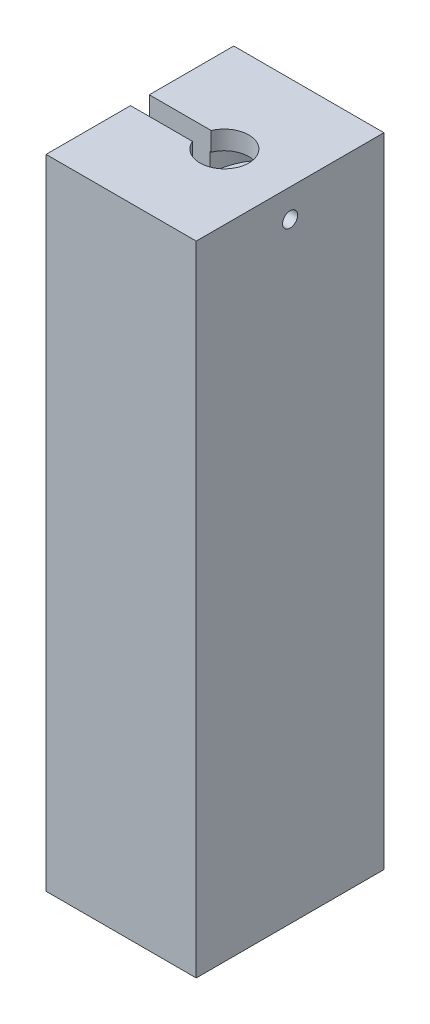
ISO-10303-21;
HEADER;
FILE_DESCRIPTION(('STEP AP214'),'2;1');
FILE_NAME('part.step','',(''),(''),'','','');
FILE_SCHEMA(('AUTOMOTIVE_DESIGN { 1 0 10303 214 1 1 1 1 }'));
ENDSEC;
DATA;
#1=APPLICATION_CONTEXT('core data for automotive mechanical design processes');
#2=APPLICATION_PROTOCOL_DEFINITION('international standard','automotive_design',2000,#1);
#3=PRODUCT_CONTEXT('',#1,'mechanical');
#4=PRODUCT('Part','Part','',(#3));
#5=PRODUCT_RELATED_PRODUCT_CATEGORY('part','',(#4));
#6=PRODUCT_DEFINITION_FORMATION('','',#4);
#7=PRODUCT_DEFINITION_CONTEXT('part definition',#1,'design');
#8=PRODUCT_DEFINITION('design','',#6,#7);
#9=PRODUCT_DEFINITION_SHAPE('','',#8);
#10=(LENGTH_UNIT() NAMED_UNIT(*) SI_UNIT(.MILLI.,.METRE.));
#11=(NAMED_UNIT(*) PLANE_ANGLE_UNIT() SI_UNIT($,.RADIAN.));
#12=(NAMED_UNIT(*) SI_UNIT($,.STERADIAN.) SOLID_ANGLE_UNIT());
#13=UNCERTAINTY_MEASURE_WITH_UNIT(LENGTH_MEASURE(1.E-05),#10,'distance_accuracy_value','');
#14=(GEOMETRIC_REPRESENTATION_CONTEXT(3) GLOBAL_UNCERTAINTY_ASSIGNED_CONTEXT((#13)) GLOBAL_UNIT_ASSIGNED_CONTEXT((#10,
#11,#12)) REPRESENTATION_CONTEXT('',''));
#15=CARTESIAN_POINT('',(0.,0.,0.));
#16=DIRECTION('',(0.,0.,1.));
#17=DIRECTION('',(1.,0.,0.));
#18=AXIS2_PLACEMENT_3D('',#15,#16,#17);
#19=CARTESIAN_POINT('',(0.,16.,0.));
#20=DIRECTION('',(0.,1.,0.));
#21=DIRECTION('',(0.,0.,1.));
#22=AXIS2_PLACEMENT_3D('',#19,#20,#21);
#23=PLANE('',#22);
#24=CARTESIAN_POINT('',(0.,16.,0.));
#25=DIRECTION('',(0.,1.,0.));
#26=DIRECTION('',(0.,0.,-1.));
#27=AXIS2_PLACEMENT_3D('',#24,#25,#26);
#28=ELLIPSE('',#27,1.3,0.65);
#29=CARTESIAN_POINT('',(-0.637867541108654,16.,0.25));
#30=VERTEX_POINT('',#29);
#31=CARTESIAN_POINT('',(-0.637867541108654,16.,-0.25));
#32=VERTEX_POINT('',#31);
#33=EDGE_CURVE('E248',#30,#32,#28,.T.);
#34=ORIENTED_EDGE('',*,*,#33,.T.);
#35=DIRECTION('',(1.,0.,0.));
#36=VECTOR('',#35,1.);
#37=CARTESIAN_POINT('',(-2.25,16.,-0.25));
#38=LINE('',#37,#36);
#39=CARTESIAN_POINT('',(-2.25,16.,-0.25));
#40=VERTEX_POINT('',#39);
#41=EDGE_CURVE('E406',#40,#32,#38,.T.);
#42=ORIENTED_EDGE('',*,*,#41,.F.);
#43=DIRECTION('',(0.,0.,-1.));
#44=VECTOR('',#43,1.);
#45=CARTESIAN_POINT('',(-2.25,16.,0.25));
#46=LINE('',#45,#44);
#47=CARTESIAN_POINT('',(-2.25,16.,0.25));
#48=VERTEX_POINT('',#47);
#49=EDGE_CURVE('E402',#48,#40,#46,.T.);
#50=ORIENTED_EDGE('',*,*,#49,.F.);
#51=DIRECTION('',(-1.,0.,0.));
#52=VECTOR('',#51,1.);
#53=CARTESIAN_POINT('',(-2.25,16.,0.25));
#54=LINE('',#53,#52);
#55=EDGE_CURVE('E210',#30,#48,#54,.T.);
#56=ORIENTED_EDGE('',*,*,#55,.F.);
#57=EDGE_LOOP('',(#34,#42,#50,#56));
#58=FACE_BOUND('',#57,.T.);
#59=CARTESIAN_POINT('',(0.,16.,0.));
#60=DIRECTION('',(0.,1.,0.));
#61=DIRECTION('',(0.,0.,1.));
#62=AXIS2_PLACEMENT_3D('',#59,#60,#61);
#63=CIRCLE('',#62,0.425);
#64=CARTESIAN_POINT('',(0.,16.,0.425));
#65=VERTEX_POINT('',#64);
#66=EDGE_CURVE('E581',#65,#65,#63,.T.);
#67=ORIENTED_EDGE('',*,*,#66,.F.);
#68=EDGE_LOOP('',(#67));
#69=FACE_BOUND('',#68,.T.);
#70=ADVANCED_FACE('F33',(#58,#69),#23,.T.);
#71=CARTESIAN_POINT('',(-2.25,15.,2.5));
#72=DIRECTION('',(1.,0.,0.));
#73=DIRECTION('',(0.,0.,-1.));
#74=AXIS2_PLACEMENT_3D('',#71,#72,#73);
#75=PLANE('',#74);
#76=ORIENTED_EDGE('',*,*,#49,.T.);
#77=DIRECTION('',(0.,1.,0.));
#78=VECTOR('',#77,1.);
#79=CARTESIAN_POINT('',(-2.25,14.2759060350433,-0.25));
#80=LINE('',#79,#78);
#81=CARTESIAN_POINT('',(-2.25,17.,-0.25));
#82=VERTEX_POINT('',#81);
#83=EDGE_CURVE('E215',#40,#82,#80,.T.);
#84=ORIENTED_EDGE('',*,*,#83,.T.);
#85=DIRECTION('',(0.,0.,1.));
#86=VECTOR('',#85,1.);
#87=CARTESIAN_POINT('',(-2.25,17.,-2.5));
#88=LINE('',#87,#86);
#89=CARTESIAN_POINT('',(-2.25,17.,-2.5));
#90=VERTEX_POINT('',#89);
#91=EDGE_CURVE('E233',#90,#82,#88,.T.);
#92=ORIENTED_EDGE('',*,*,#91,.F.);
#93=DIRECTION('',(0.,-1.,0.));
#94=VECTOR('',#93,1.);
#95=CARTESIAN_POINT('',(-2.25,15.,-2.5));
#96=LINE('',#95,#94);
#97=CARTESIAN_POINT('',(-2.25,0.,-2.5));
#98=VERTEX_POINT('',#97);
#99=EDGE_CURVE('E454',#90,#98,#96,.T.);
#100=ORIENTED_EDGE('',*,*,#99,.T.);
#101=DIRECTION('',(0.,0.,1.));
#102=VECTOR('',#101,1.);
#103=CARTESIAN_POINT('',(-2.25,0.,2.5));
#104=LINE('',#103,#102);
#105=CARTESIAN_POINT('',(-2.25,0.,-0.915000000000001));
#106=VERTEX_POINT('',#105);
#107=EDGE_CURVE('E569',#98,#106,#104,.T.);
#108=ORIENTED_EDGE('',*,*,#107,.T.);
#109=DIRECTION('',(0.,-1.,0.));
#110=VECTOR('',#109,1.);
#111=CARTESIAN_POINT('',(-2.25,15.,-0.915000000000001));
#112=LINE('',#111,#110);
#113=CARTESIAN_POINT('',(-2.25,15.,-0.915000000000001));
#114=VERTEX_POINT('',#113);
#115=EDGE_CURVE('E563',#114,#106,#112,.T.);
#116=ORIENTED_EDGE('',*,*,#115,.F.);
#117=DIRECTION('',(0.,0.,1.));
#118=VECTOR('',#117,1.);
#119=CARTESIAN_POINT('',(-2.25,15.,-2.5));
#120=LINE('',#119,#118);
#121=CARTESIAN_POINT('',(-2.25,15.,0.915000000000001));
#122=VERTEX_POINT('',#121);
#123=EDGE_CURVE('E522',#114,#122,#120,.T.);
#124=ORIENTED_EDGE('',*,*,#123,.T.);
#125=DIRECTION('',(0.,1.,0.));
#126=VECTOR('',#125,1.);
#127=CARTESIAN_POINT('',(-2.25,15.,0.915000000000001));
#128=LINE('',#127,#126);
#129=CARTESIAN_POINT('',(-2.25,0.,0.915000000000001));
#130=VERTEX_POINT('',#129);
#131=EDGE_CURVE('E560',#130,#122,#128,.T.);
#132=ORIENTED_EDGE('',*,*,#131,.F.);
#133=CARTESIAN_POINT('',(-2.25,0.,2.5));
#134=VERTEX_POINT('',#133);
#135=EDGE_CURVE('E568',#130,#134,#104,.T.);
#136=ORIENTED_EDGE('',*,*,#135,.T.);
#137=DIRECTION('',(0.,-1.,0.));
#138=VECTOR('',#137,1.);
#139=CARTESIAN_POINT('',(-2.25,15.,2.5));
#140=LINE('',#139,#138);
#141=CARTESIAN_POINT('',(-2.25,17.,2.5));
#142=VERTEX_POINT('',#141);
#143=EDGE_CURVE('E231',#142,#134,#140,.T.);
#144=ORIENTED_EDGE('',*,*,#143,.F.);
#145=CARTESIAN_POINT('',(-2.25,17.,0.25));
#146=VERTEX_POINT('',#145);
#147=EDGE_CURVE('E223',#146,#142,#88,.T.);
#148=ORIENTED_EDGE('',*,*,#147,.F.);
#149=DIRECTION('',(0.,1.,0.));
#150=VECTOR('',#149,1.);
#151=CARTESIAN_POINT('',(-2.25,14.2759060350433,0.25));
#152=LINE('',#151,#150);
#153=EDGE_CURVE('E207',#48,#146,#152,.T.);
#154=ORIENTED_EDGE('',*,*,#153,.F.);
#155=EDGE_LOOP('',(#76,#84,#92,#100,#108,#116,#124,#132,#136,#144,#148,#154));
#156=FACE_BOUND('',#155,.T.);
#157=ADVANCED_FACE('F229',(#156),#75,.F.);
#158=CARTESIAN_POINT('',(0.,0.,0.));
#159=DIRECTION('',(0.,-1.,0.));
#160=DIRECTION('',(0.,0.,-1.));
#161=AXIS2_PLACEMENT_3D('',#158,#159,#160);
#162=PLANE('',#161);
#163=DIRECTION('',(-1.,0.,0.));
#164=VECTOR('',#163,1.);
#165=CARTESIAN_POINT('',(-2.,0.,-0.56));
#166=LINE('',#165,#164);
#167=CARTESIAN_POINT('',(-1.625,0.,-0.56));
#168=VERTEX_POINT('',#167);
#169=CARTESIAN_POINT('',(-1.875,0.,-0.56));
#170=VERTEX_POINT('',#169);
#171=EDGE_CURVE('E528',#168,#170,#166,.T.);
#172=ORIENTED_EDGE('',*,*,#171,.T.);
#173=CARTESIAN_POINT('',(-1.875,0.,-0.685));
#174=DIRECTION('',(0.,-1.,0.));
#175=DIRECTION('',(0.,0.,-1.));
#176=AXIS2_PLACEMENT_3D('',#173,#174,#175);
#177=CIRCLE('',#176,0.125);
#178=CARTESIAN_POINT('',(-2.,0.,-0.685));
#179=VERTEX_POINT('',#178);
#180=EDGE_CURVE('E476',#170,#179,#177,.T.);
#181=ORIENTED_EDGE('',*,*,#180,.T.);
#182=DIRECTION('',(0.,0.,-1.));
#183=VECTOR('',#182,1.);
#184=CARTESIAN_POINT('',(-2.,0.,-0.93));
#185=LINE('',#184,#183);
#186=CARTESIAN_POINT('',(-2.,0.,-0.93));
#187=VERTEX_POINT('',#186);
#188=EDGE_CURVE('E485',#179,#187,#185,.T.);
#189=ORIENTED_EDGE('',*,*,#188,.T.);
#190=DIRECTION('',(-0.998204845465779,0.,0.0598922907279451));
#191=VECTOR('',#190,1.);
#192=CARTESIAN_POINT('',(-2.50000000000002,0.,-0.9));
#193=LINE('',#192,#191);
#194=EDGE_CURVE('E531',#187,#106,#193,.T.);
#195=ORIENTED_EDGE('',*,*,#194,.T.);
#196=ORIENTED_EDGE('',*,*,#107,.F.);
#197=DIRECTION('',(-1.,0.,0.));
#198=VECTOR('',#197,1.);
#199=CARTESIAN_POINT('',(-2.25,0.,-2.5));
#200=LINE('',#199,#198);
#201=CARTESIAN_POINT('',(1.75,0.,-2.5));
#202=VERTEX_POINT('',#201);
#203=EDGE_CURVE('E455',#202,#98,#200,.T.);
#204=ORIENTED_EDGE('',*,*,#203,.F.);
#205=DIRECTION('',(0.,0.,-1.));
#206=VECTOR('',#205,1.);
#207=CARTESIAN_POINT('',(1.75,0.,2.5));
#208=LINE('',#207,#206);
#209=CARTESIAN_POINT('',(1.75,0.,2.5));
#210=VERTEX_POINT('',#209);
#211=EDGE_CURVE('E565',#210,#202,#208,.T.);
#212=ORIENTED_EDGE('',*,*,#211,.F.);
#213=DIRECTION('',(1.,0.,0.));
#214=VECTOR('',#213,1.);
#215=CARTESIAN_POINT('',(-2.25,0.,2.5));
#216=LINE('',#215,#214);
#217=EDGE_CURVE('E571',#134,#210,#216,.T.);
#218=ORIENTED_EDGE('',*,*,#217,.F.);
#219=ORIENTED_EDGE('',*,*,#135,.F.);
#220=DIRECTION('',(0.998204845465779,0.,0.0598922907279451));
#221=VECTOR('',#220,1.);
#222=CARTESIAN_POINT('',(-0.0627740135512138,0.,1.04623355918692));
#223=LINE('',#222,#221);
#224=CARTESIAN_POINT('',(-2.,0.,0.93));
#225=VERTEX_POINT('',#224);
#226=EDGE_CURVE('E459',#130,#225,#223,.T.);
#227=ORIENTED_EDGE('',*,*,#226,.T.);
#228=DIRECTION('',(0.,0.,-1.));
#229=VECTOR('',#228,1.);
#230=CARTESIAN_POINT('',(-2.,0.,0.93));
#231=LINE('',#230,#229);
#232=CARTESIAN_POINT('',(-2.,0.,0.685));
#233=VERTEX_POINT('',#232);
#234=EDGE_CURVE('E534',#225,#233,#231,.T.);
#235=ORIENTED_EDGE('',*,*,#234,.T.);
#236=CARTESIAN_POINT('',(-1.875,0.,0.685));
#237=DIRECTION('',(0.,-1.,0.));
#238=DIRECTION('',(0.,0.,-1.));
#239=AXIS2_PLACEMENT_3D('',#236,#237,#238);
#240=CIRCLE('',#239,0.125);
#241=CARTESIAN_POINT('',(-1.875,0.,0.56));
#242=VERTEX_POINT('',#241);
#243=EDGE_CURVE('E471',#233,#242,#240,.T.);
#244=ORIENTED_EDGE('',*,*,#243,.T.);
#245=DIRECTION('',(1.,0.,0.));
#246=VECTOR('',#245,1.);
#247=CARTESIAN_POINT('',(-1.5,0.,0.56));
#248=LINE('',#247,#246);
#249=CARTESIAN_POINT('',(-1.625,0.,0.56));
#250=VERTEX_POINT('',#249);
#251=EDGE_CURVE('E537',#242,#250,#248,.T.);
#252=ORIENTED_EDGE('',*,*,#251,.T.);
#253=CARTESIAN_POINT('',(-1.625,0.,0.685));
#254=DIRECTION('',(0.,-1.,0.));
#255=DIRECTION('',(0.,0.,-1.));
#256=AXIS2_PLACEMENT_3D('',#253,#254,#255);
#257=CIRCLE('',#256,0.125);
#258=CARTESIAN_POINT('',(-1.5,0.,0.685));
#259=VERTEX_POINT('',#258);
#260=EDGE_CURVE('E474',#250,#259,#257,.T.);
#261=ORIENTED_EDGE('',*,*,#260,.T.);
#262=DIRECTION('',(0.,0.,1.));
#263=VECTOR('',#262,1.);
#264=CARTESIAN_POINT('',(-1.5,0.,0.56));
#265=LINE('',#264,#263);
#266=CARTESIAN_POINT('',(-1.5,0.,0.96));
#267=VERTEX_POINT('',#266);
#268=EDGE_CURVE('E540',#259,#267,#265,.T.);
#269=ORIENTED_EDGE('',*,*,#268,.T.);
#270=DIRECTION('',(0.998204845465779,0.,0.0598922907279466));
#271=VECTOR('',#270,1.);
#272=CARTESIAN_POINT('',(0.,0.,1.05));
#273=LINE('',#272,#271);
#274=CARTESIAN_POINT('',(0.,0.,1.05));
#275=VERTEX_POINT('',#274);
#276=EDGE_CURVE('E542',#267,#275,#273,.T.);
#277=ORIENTED_EDGE('',*,*,#276,.T.);
#278=CARTESIAN_POINT('',(0.,0.,0.));
#279=DIRECTION('',(0.,1.,0.));
#280=DIRECTION('',(0.,0.,-1.));
#281=AXIS2_PLACEMENT_3D('',#278,#279,#280);
#282=CIRCLE('',#281,1.05);
#283=CARTESIAN_POINT('',(0.,0.,-1.05));
#284=VERTEX_POINT('',#283);
#285=EDGE_CURVE('E518',#275,#284,#282,.T.);
#286=ORIENTED_EDGE('',*,*,#285,.T.);
#287=DIRECTION('',(-0.998204845465779,0.,0.0598922907279466));
#288=VECTOR('',#287,1.);
#289=CARTESIAN_POINT('',(-1.5,0.,-0.96));
#290=LINE('',#289,#288);
#291=CARTESIAN_POINT('',(-1.5,0.,-0.96));
#292=VERTEX_POINT('',#291);
#293=EDGE_CURVE('E521',#284,#292,#290,.T.);
#294=ORIENTED_EDGE('',*,*,#293,.T.);
#295=DIRECTION('',(0.,0.,1.));
#296=VECTOR('',#295,1.);
#297=CARTESIAN_POINT('',(-1.5,0.,-0.96));
#298=LINE('',#297,#296);
#299=CARTESIAN_POINT('',(-1.5,0.,-0.685));
#300=VERTEX_POINT('',#299);
#301=EDGE_CURVE('E525',#292,#300,#298,.T.);
#302=ORIENTED_EDGE('',*,*,#301,.T.);
#303=CARTESIAN_POINT('',(-1.625,0.,-0.685));
#304=DIRECTION('',(0.,-1.,0.));
#305=DIRECTION('',(0.,0.,-1.));
#306=AXIS2_PLACEMENT_3D('',#303,#304,#305);
#307=CIRCLE('',#306,0.125);
#308=EDGE_CURVE('E56',#300,#168,#307,.T.);
#309=ORIENTED_EDGE('',*,*,#308,.T.);
#310=EDGE_LOOP('',(#172,#181,#189,#195,#196,#204,#212,#218,#219,#227,#235,#244,#252,#261,#269,
#277,#286,#294,#302,#309));
#311=FACE_BOUND('',#310,.T.);
#312=ADVANCED_FACE('F320',(#311),#162,.T.);
#313=CARTESIAN_POINT('',(1.75,15.,2.5));
#314=DIRECTION('',(-1.,0.,0.));
#315=DIRECTION('',(0.,0.,1.));
#316=AXIS2_PLACEMENT_3D('',#313,#314,#315);
#317=PLANE('',#316);
#318=CARTESIAN_POINT('',(1.75,16.25,0.));
#319=DIRECTION('',(1.,0.,0.));
#320=DIRECTION('',(0.,0.,-1.));
#321=AXIS2_PLACEMENT_3D('',#318,#319,#320);
#322=CIRCLE('',#321,0.199999999999999);
#323=CARTESIAN_POINT('',(1.75,16.25,-0.199999999999999));
#324=VERTEX_POINT('',#323);
#325=EDGE_CURVE('E227',#324,#324,#322,.T.);
#326=ORIENTED_EDGE('',*,*,#325,.F.);
#327=EDGE_LOOP('',(#326));
#328=FACE_BOUND('',#327,.T.);
#329=ORIENTED_EDGE('',*,*,#211,.T.);
#330=DIRECTION('',(0.,-1.,0.));
#331=VECTOR('',#330,1.);
#332=CARTESIAN_POINT('',(1.75,15.,-2.5));
#333=LINE('',#332,#331);
#334=CARTESIAN_POINT('',(1.75,17.,-2.5));
#335=VERTEX_POINT('',#334);
#336=EDGE_CURVE('E452',#335,#202,#333,.T.);
#337=ORIENTED_EDGE('',*,*,#336,.F.);
#338=DIRECTION('',(0.,0.,-1.));
#339=VECTOR('',#338,1.);
#340=CARTESIAN_POINT('',(1.75,17.,-2.5));
#341=LINE('',#340,#339);
#342=CARTESIAN_POINT('',(1.75,17.,2.5));
#343=VERTEX_POINT('',#342);
#344=EDGE_CURVE('E242',#343,#335,#341,.T.);
#345=ORIENTED_EDGE('',*,*,#344,.F.);
#346=DIRECTION('',(0.,-1.,0.));
#347=VECTOR('',#346,1.);
#348=CARTESIAN_POINT('',(1.75,15.,2.5));
#349=LINE('',#348,#347);
#350=EDGE_CURVE('E461',#343,#210,#349,.T.);
#351=ORIENTED_EDGE('',*,*,#350,.T.);
#352=EDGE_LOOP('',(#329,#337,#345,#351));
#353=FACE_BOUND('',#352,.T.);
#354=ADVANCED_FACE('F323',(#328,#353),#317,.F.);
#355=CARTESIAN_POINT('',(-2.25,15.,-2.5));
#356=DIRECTION('',(0.,0.,1.));
#357=DIRECTION('',(1.,0.,0.));
#358=AXIS2_PLACEMENT_3D('',#355,#356,#357);
#359=PLANE('',#358);
#360=ORIENTED_EDGE('',*,*,#203,.T.);
#361=ORIENTED_EDGE('',*,*,#99,.F.);
#362=DIRECTION('',(-1.,0.,0.));
#363=VECTOR('',#362,1.);
#364=CARTESIAN_POINT('',(-2.25,17.,-2.5));
#365=LINE('',#364,#363);
#366=EDGE_CURVE('E245',#335,#90,#365,.T.);
#367=ORIENTED_EDGE('',*,*,#366,.F.);
#368=ORIENTED_EDGE('',*,*,#336,.T.);
#369=EDGE_LOOP('',(#360,#361,#367,#368));
#370=FACE_BOUND('',#369,.T.);
#371=ADVANCED_FACE('F327',(#370),#359,.F.);
#372=CARTESIAN_POINT('',(-2.25,15.,2.5));
#373=DIRECTION('',(0.,0.,-1.));
#374=DIRECTION('',(-1.,0.,0.));
#375=AXIS2_PLACEMENT_3D('',#372,#373,#374);
#376=PLANE('',#375);
#377=ORIENTED_EDGE('',*,*,#217,.T.);
#378=ORIENTED_EDGE('',*,*,#350,.F.);
#379=DIRECTION('',(1.,0.,0.));
#380=VECTOR('',#379,1.);
#381=CARTESIAN_POINT('',(-2.25,17.,2.5));
#382=LINE('',#381,#380);
#383=EDGE_CURVE('E236',#142,#343,#382,.T.);
#384=ORIENTED_EDGE('',*,*,#383,.F.);
#385=ORIENTED_EDGE('',*,*,#143,.T.);
#386=EDGE_LOOP('',(#377,#378,#384,#385));
#387=FACE_BOUND('',#386,.T.);
#388=ADVANCED_FACE('F300',(#387),#376,.F.);
#389=CARTESIAN_POINT('',(-2.50000000000002,15.,-0.9));
#390=DIRECTION('',(0.0598922907279451,0.,0.998204845465779));
#391=DIRECTION('',(0.998204845465779,0.,-0.0598922907279451));
#392=AXIS2_PLACEMENT_3D('',#389,#390,#391);
#393=PLANE('',#392);
#394=ORIENTED_EDGE('',*,*,#115,.T.);
#395=ORIENTED_EDGE('',*,*,#194,.F.);
#396=DIRECTION('',(0.,-1.,0.));
#397=VECTOR('',#396,1.);
#398=CARTESIAN_POINT('',(-2.,15.,-0.93));
#399=LINE('',#398,#397);
#400=CARTESIAN_POINT('',(-2.,15.,-0.93));
#401=VERTEX_POINT('',#400);
#402=EDGE_CURVE('E553',#401,#187,#399,.T.);
#403=ORIENTED_EDGE('',*,*,#402,.F.);
#404=DIRECTION('',(-0.998204845465779,0.,0.0598922907279451));
#405=VECTOR('',#404,1.);
#406=CARTESIAN_POINT('',(-2.50000000000002,15.,-0.9));
#407=LINE('',#406,#405);
#408=EDGE_CURVE('E494',#401,#114,#407,.T.);
#409=ORIENTED_EDGE('',*,*,#408,.T.);
#410=EDGE_LOOP('',(#394,#395,#403,#409));
#411=FACE_BOUND('',#410,.T.);
#412=ADVANCED_FACE('F296',(#411),#393,.T.);
#413=CARTESIAN_POINT('',(-2.50000000000002,15.,0.9));
#414=DIRECTION('',(0.0598922907279451,0.,-0.998204845465779));
#415=DIRECTION('',(-0.998204845465779,0.,-0.0598922907279451));
#416=AXIS2_PLACEMENT_3D('',#413,#414,#415);
#417=PLANE('',#416);
#418=ORIENTED_EDGE('',*,*,#131,.T.);
#419=DIRECTION('',(0.998204845465779,0.,0.0598922907279451));
#420=VECTOR('',#419,1.);
#421=CARTESIAN_POINT('',(-2.50000000000002,15.,0.9));
#422=LINE('',#421,#420);
#423=CARTESIAN_POINT('',(-2.,15.,0.93));
#424=VERTEX_POINT('',#423);
#425=EDGE_CURVE('E502',#122,#424,#422,.T.);
#426=ORIENTED_EDGE('',*,*,#425,.T.);
#427=DIRECTION('',(0.,-1.,0.));
#428=VECTOR('',#427,1.);
#429=CARTESIAN_POINT('',(-2.,15.,0.93));
#430=LINE('',#429,#428);
#431=EDGE_CURVE('E551',#424,#225,#430,.T.);
#432=ORIENTED_EDGE('',*,*,#431,.T.);
#433=ORIENTED_EDGE('',*,*,#226,.F.);
#434=EDGE_LOOP('',(#418,#426,#432,#433));
#435=FACE_BOUND('',#434,.T.);
#436=ADVANCED_FACE('F292',(#435),#417,.T.);
#437=CARTESIAN_POINT('',(0.,15.,0.));
#438=DIRECTION('',(0.,-1.,0.));
#439=DIRECTION('',(0.,0.,-1.));
#440=AXIS2_PLACEMENT_3D('',#437,#438,#439);
#441=CYLINDRICAL_SURFACE('',#440,1.05);
#442=ORIENTED_EDGE('',*,*,#285,.F.);
#443=DIRECTION('',(0.,-1.,0.));
#444=VECTOR('',#443,1.);
#445=CARTESIAN_POINT('',(0.,15.,1.05));
#446=LINE('',#445,#444);
#447=CARTESIAN_POINT('',(0.,15.,1.05));
#448=VERTEX_POINT('',#447);
#449=EDGE_CURVE('E517',#448,#275,#446,.T.);
#450=ORIENTED_EDGE('',*,*,#449,.F.);
#451=CARTESIAN_POINT('',(0.,15.,0.));
#452=DIRECTION('',(0.,1.,0.));
#453=DIRECTION('',(0.,0.,-1.));
#454=AXIS2_PLACEMENT_3D('',#451,#452,#453);
#455=CIRCLE('',#454,1.05);
#456=CARTESIAN_POINT('',(0.,15.,-1.05));
#457=VERTEX_POINT('',#456);
#458=EDGE_CURVE('E545',#448,#457,#455,.T.);
#459=ORIENTED_EDGE('',*,*,#458,.T.);
#460=DIRECTION('',(0.,-1.,0.));
#461=VECTOR('',#460,1.);
#462=CARTESIAN_POINT('',(0.,15.,-1.05));
#463=LINE('',#462,#461);
#464=EDGE_CURVE('E557',#457,#284,#463,.T.);
#465=ORIENTED_EDGE('',*,*,#464,.T.);
#466=EDGE_LOOP('',(#442,#450,#459,#465));
#467=FACE_BOUND('',#466,.T.);
#468=ADVANCED_FACE('F295',(#467),#441,.F.);
#469=CARTESIAN_POINT('',(-1.5,15.,-0.96));
#470=DIRECTION('',(0.0598922907279466,0.,0.998204845465779));
#471=DIRECTION('',(0.998204845465779,0.,-0.0598922907279466));
#472=AXIS2_PLACEMENT_3D('',#469,#470,#471);
#473=PLANE('',#472);
#474=ORIENTED_EDGE('',*,*,#293,.F.);
#475=ORIENTED_EDGE('',*,*,#464,.F.);
#476=DIRECTION('',(-0.998204845465779,0.,0.0598922907279466));
#477=VECTOR('',#476,1.);
#478=CARTESIAN_POINT('',(-1.5,15.,-0.96));
#479=LINE('',#478,#477);
#480=CARTESIAN_POINT('',(-1.5,15.,-0.96));
#481=VERTEX_POINT('',#480);
#482=EDGE_CURVE('E496',#457,#481,#479,.T.);
#483=ORIENTED_EDGE('',*,*,#482,.T.);
#484=DIRECTION('',(0.,-1.,0.));
#485=VECTOR('',#484,1.);
#486=CARTESIAN_POINT('',(-1.5,15.,-0.96));
#487=LINE('',#486,#485);
#488=EDGE_CURVE('E555',#481,#292,#487,.T.);
#489=ORIENTED_EDGE('',*,*,#488,.T.);
#490=EDGE_LOOP('',(#474,#475,#483,#489));
#491=FACE_BOUND('',#490,.T.);
#492=ADVANCED_FACE('F312',(#491),#473,.T.);
#493=CARTESIAN_POINT('',(-1.5,15.,-0.96));
#494=DIRECTION('',(1.,0.,0.));
#495=DIRECTION('',(0.,0.,-1.));
#496=AXIS2_PLACEMENT_3D('',#493,#494,#495);
#497=PLANE('',#496);
#498=DIRECTION('',(0.,0.,1.));
#499=VECTOR('',#498,1.);
#500=CARTESIAN_POINT('',(-1.5,15.,-0.96));
#501=LINE('',#500,#499);
#502=CARTESIAN_POINT('',(-1.5,15.,-0.685));
#503=VERTEX_POINT('',#502);
#504=EDGE_CURVE('E492',#481,#503,#501,.T.);
#505=ORIENTED_EDGE('',*,*,#504,.T.);
#506=DIRECTION('',(0.,-1.,0.));
#507=VECTOR('',#506,1.);
#508=CARTESIAN_POINT('',(-1.5,15.,-0.685));
#509=LINE('',#508,#507);
#510=EDGE_CURVE('E353',#503,#300,#509,.T.);
#511=ORIENTED_EDGE('',*,*,#510,.T.);
#512=ORIENTED_EDGE('',*,*,#301,.F.);
#513=ORIENTED_EDGE('',*,*,#488,.F.);
#514=EDGE_LOOP('',(#505,#511,#512,#513));
#515=FACE_BOUND('',#514,.T.);
#516=ADVANCED_FACE('F308',(#515),#497,.T.);
#517=CARTESIAN_POINT('',(-2.,15.,-0.56));
#518=DIRECTION('',(0.,0.,1.));
#519=DIRECTION('',(1.,0.,0.));
#520=AXIS2_PLACEMENT_3D('',#517,#518,#519);
#521=PLANE('',#520);
#522=DIRECTION('',(-1.,0.,0.));
#523=VECTOR('',#522,1.);
#524=CARTESIAN_POINT('',(-2.,15.,-0.56));
#525=LINE('',#524,#523);
#526=CARTESIAN_POINT('',(-1.625,15.,-0.56));
#527=VERTEX_POINT('',#526);
#528=CARTESIAN_POINT('',(-1.875,15.,-0.56));
#529=VERTEX_POINT('',#528);
#530=EDGE_CURVE('E489',#527,#529,#525,.T.);
#531=ORIENTED_EDGE('',*,*,#530,.T.);
#532=DIRECTION('',(0.,-1.,0.));
#533=VECTOR('',#532,1.);
#534=CARTESIAN_POINT('',(-1.875,15.,-0.56));
#535=LINE('',#534,#533);
#536=EDGE_CURVE('E468',#529,#170,#535,.T.);
#537=ORIENTED_EDGE('',*,*,#536,.T.);
#538=ORIENTED_EDGE('',*,*,#171,.F.);
#539=DIRECTION('',(0.,-1.,0.));
#540=VECTOR('',#539,1.);
#541=CARTESIAN_POINT('',(-1.625,15.,-0.56));
#542=LINE('',#541,#540);
#543=EDGE_CURVE('E352',#168,#527,#542,.F.);
#544=ORIENTED_EDGE('',*,*,#543,.T.);
#545=EDGE_LOOP('',(#531,#537,#538,#544));
#546=FACE_BOUND('',#545,.T.);
#547=ADVANCED_FACE('F304',(#546),#521,.T.);
#548=CARTESIAN_POINT('',(-2.,15.,-0.93));
#549=DIRECTION('',(-1.,0.,0.));
#550=DIRECTION('',(0.,0.,1.));
#551=AXIS2_PLACEMENT_3D('',#548,#549,#550);
#552=PLANE('',#551);
#553=ORIENTED_EDGE('',*,*,#188,.F.);
#554=DIRECTION('',(0.,-1.,0.));
#555=VECTOR('',#554,1.);
#556=CARTESIAN_POINT('',(-2.,15.,-0.685));
#557=LINE('',#556,#555);
#558=CARTESIAN_POINT('',(-2.,15.,-0.685));
#559=VERTEX_POINT('',#558);
#560=EDGE_CURVE('E360',#179,#559,#557,.F.);
#561=ORIENTED_EDGE('',*,*,#560,.T.);
#562=DIRECTION('',(0.,0.,-1.));
#563=VECTOR('',#562,1.);
#564=CARTESIAN_POINT('',(-2.,15.,-0.93));
#565=LINE('',#564,#563);
#566=EDGE_CURVE('E483',#559,#401,#565,.T.);
#567=ORIENTED_EDGE('',*,*,#566,.T.);
#568=ORIENTED_EDGE('',*,*,#402,.T.);
#569=EDGE_LOOP('',(#553,#561,#567,#568));
#570=FACE_BOUND('',#569,.T.);
#571=ADVANCED_FACE('F290',(#570),#552,.T.);
#572=CARTESIAN_POINT('',(-2.,15.,0.93));
#573=DIRECTION('',(-1.,0.,0.));
#574=DIRECTION('',(0.,0.,1.));
#575=AXIS2_PLACEMENT_3D('',#572,#573,#574);
#576=PLANE('',#575);
#577=DIRECTION('',(0.,0.,-1.));
#578=VECTOR('',#577,1.);
#579=CARTESIAN_POINT('',(-2.,15.,0.93));
#580=LINE('',#579,#578);
#581=CARTESIAN_POINT('',(-2.,15.,0.685));
#582=VERTEX_POINT('',#581);
#583=EDGE_CURVE('E505',#424,#582,#580,.T.);
#584=ORIENTED_EDGE('',*,*,#583,.T.);
#585=DIRECTION('',(0.,-1.,0.));
#586=VECTOR('',#585,1.);
#587=CARTESIAN_POINT('',(-2.,15.,0.685));
#588=LINE('',#587,#586);
#589=EDGE_CURVE('E375',#582,#233,#588,.T.);
#590=ORIENTED_EDGE('',*,*,#589,.T.);
#591=ORIENTED_EDGE('',*,*,#234,.F.);
#592=ORIENTED_EDGE('',*,*,#431,.F.);
#593=EDGE_LOOP('',(#584,#590,#591,#592));
#594=FACE_BOUND('',#593,.T.);
#595=ADVANCED_FACE('F286',(#594),#576,.T.);
#596=CARTESIAN_POINT('',(-1.5,15.,0.56));
#597=DIRECTION('',(0.,0.,-1.));
#598=DIRECTION('',(-1.,0.,0.));
#599=AXIS2_PLACEMENT_3D('',#596,#597,#598);
#600=PLANE('',#599);
#601=DIRECTION('',(1.,0.,0.));
#602=VECTOR('',#601,1.);
#603=CARTESIAN_POINT('',(-1.5,15.,0.56));
#604=LINE('',#603,#602);
#605=CARTESIAN_POINT('',(-1.875,15.,0.56));
#606=VERTEX_POINT('',#605);
#607=CARTESIAN_POINT('',(-1.625,15.,0.56));
#608=VERTEX_POINT('',#607);
#609=EDGE_CURVE('E508',#606,#608,#604,.T.);
#610=ORIENTED_EDGE('',*,*,#609,.T.);
#611=DIRECTION('',(0.,-1.,0.));
#612=VECTOR('',#611,1.);
#613=CARTESIAN_POINT('',(-1.625,15.,0.56));
#614=LINE('',#613,#612);
#615=EDGE_CURVE('E368',#608,#250,#614,.T.);
#616=ORIENTED_EDGE('',*,*,#615,.T.);
#617=ORIENTED_EDGE('',*,*,#251,.F.);
#618=DIRECTION('',(0.,-1.,0.));
#619=VECTOR('',#618,1.);
#620=CARTESIAN_POINT('',(-1.875,15.,0.56));
#621=LINE('',#620,#619);
#622=EDGE_CURVE('E365',#242,#606,#621,.F.);
#623=ORIENTED_EDGE('',*,*,#622,.T.);
#624=EDGE_LOOP('',(#610,#616,#617,#623));
#625=FACE_BOUND('',#624,.T.);
#626=ADVANCED_FACE('F282',(#625),#600,.T.);
#627=CARTESIAN_POINT('',(-1.5,15.,0.56));
#628=DIRECTION('',(1.,0.,0.));
#629=DIRECTION('',(0.,0.,-1.));
#630=AXIS2_PLACEMENT_3D('',#627,#628,#629);
#631=PLANE('',#630);
#632=ORIENTED_EDGE('',*,*,#268,.F.);
#633=DIRECTION('',(0.,-1.,0.));
#634=VECTOR('',#633,1.);
#635=CARTESIAN_POINT('',(-1.5,15.,0.685));
#636=LINE('',#635,#634);
#637=CARTESIAN_POINT('',(-1.5,15.,0.685));
#638=VERTEX_POINT('',#637);
#639=EDGE_CURVE('E371',#259,#638,#636,.F.);
#640=ORIENTED_EDGE('',*,*,#639,.T.);
#641=DIRECTION('',(0.,0.,1.));
#642=VECTOR('',#641,1.);
#643=CARTESIAN_POINT('',(-1.5,15.,0.56));
#644=LINE('',#643,#642);
#645=CARTESIAN_POINT('',(-1.5,15.,0.96));
#646=VERTEX_POINT('',#645);
#647=EDGE_CURVE('E511',#638,#646,#644,.T.);
#648=ORIENTED_EDGE('',*,*,#647,.T.);
#649=DIRECTION('',(0.,-1.,0.));
#650=VECTOR('',#649,1.);
#651=CARTESIAN_POINT('',(-1.5,15.,0.96));
#652=LINE('',#651,#650);
#653=EDGE_CURVE('E548',#646,#267,#652,.T.);
#654=ORIENTED_EDGE('',*,*,#653,.T.);
#655=EDGE_LOOP('',(#632,#640,#648,#654));
#656=FACE_BOUND('',#655,.T.);
#657=ADVANCED_FACE('F278',(#656),#631,.T.);
#658=CARTESIAN_POINT('',(0.,15.,1.05));
#659=DIRECTION('',(0.0598922907279466,0.,-0.998204845465779));
#660=DIRECTION('',(-0.998204845465779,0.,-0.0598922907279466));
#661=AXIS2_PLACEMENT_3D('',#658,#659,#660);
#662=PLANE('',#661);
#663=ORIENTED_EDGE('',*,*,#276,.F.);
#664=ORIENTED_EDGE('',*,*,#653,.F.);
#665=DIRECTION('',(0.998204845465779,0.,0.0598922907279466));
#666=VECTOR('',#665,1.);
#667=CARTESIAN_POINT('',(0.,15.,1.05));
#668=LINE('',#667,#666);
#669=EDGE_CURVE('E514',#646,#448,#668,.T.);
#670=ORIENTED_EDGE('',*,*,#669,.T.);
#671=ORIENTED_EDGE('',*,*,#449,.T.);
#672=EDGE_LOOP('',(#663,#664,#670,#671));
#673=FACE_BOUND('',#672,.T.);
#674=ADVANCED_FACE('F274',(#673),#662,.T.);
#675=CARTESIAN_POINT('',(-1.875,15.,-0.685));
#676=DIRECTION('',(0.,-1.,0.));
#677=DIRECTION('',(0.,0.,-1.));
#678=AXIS2_PLACEMENT_3D('',#675,#676,#677);
#679=CYLINDRICAL_SURFACE('',#678,0.125);
#680=CARTESIAN_POINT('',(-1.875,15.,-0.685));
#681=DIRECTION('',(0.,-1.,0.));
#682=DIRECTION('',(0.,0.,-1.));
#683=AXIS2_PLACEMENT_3D('',#680,#681,#682);
#684=CIRCLE('',#683,0.125);
#685=EDGE_CURVE('E358',#559,#529,#684,.F.);
#686=ORIENTED_EDGE('',*,*,#685,.F.);
#687=ORIENTED_EDGE('',*,*,#560,.F.);
#688=ORIENTED_EDGE('',*,*,#180,.F.);
#689=ORIENTED_EDGE('',*,*,#536,.F.);
#690=EDGE_LOOP('',(#686,#687,#688,#689));
#691=FACE_BOUND('',#690,.T.);
#692=ADVANCED_FACE('F277',(#691),#679,.T.);
#693=CARTESIAN_POINT('',(-1.625,15.,0.685));
#694=DIRECTION('',(0.,-1.,0.));
#695=DIRECTION('',(0.,0.,-1.));
#696=AXIS2_PLACEMENT_3D('',#693,#694,#695);
#697=CYLINDRICAL_SURFACE('',#696,0.125);
#698=CARTESIAN_POINT('',(-1.625,15.,0.685));
#699=DIRECTION('',(0.,-1.,0.));
#700=DIRECTION('',(0.,0.,-1.));
#701=AXIS2_PLACEMENT_3D('',#698,#699,#700);
#702=CIRCLE('',#701,0.125);
#703=EDGE_CURVE('E355',#638,#608,#702,.F.);
#704=ORIENTED_EDGE('',*,*,#703,.F.);
#705=ORIENTED_EDGE('',*,*,#639,.F.);
#706=ORIENTED_EDGE('',*,*,#260,.F.);
#707=ORIENTED_EDGE('',*,*,#615,.F.);
#708=EDGE_LOOP('',(#704,#705,#706,#707));
#709=FACE_BOUND('',#708,.T.);
#710=ADVANCED_FACE('F339',(#709),#697,.T.);
#711=CARTESIAN_POINT('',(-1.625,15.,-0.685));
#712=DIRECTION('',(0.,-1.,0.));
#713=DIRECTION('',(0.,0.,-1.));
#714=AXIS2_PLACEMENT_3D('',#711,#712,#713);
#715=CYLINDRICAL_SURFACE('',#714,0.125);
#716=CARTESIAN_POINT('',(-1.625,15.,-0.685));
#717=DIRECTION('',(0.,-1.,0.));
#718=DIRECTION('',(0.,0.,-1.));
#719=AXIS2_PLACEMENT_3D('',#716,#717,#718);
#720=CIRCLE('',#719,0.125);
#721=EDGE_CURVE('E350',#527,#503,#720,.F.);
#722=ORIENTED_EDGE('',*,*,#721,.F.);
#723=ORIENTED_EDGE('',*,*,#543,.F.);
#724=ORIENTED_EDGE('',*,*,#308,.F.);
#725=ORIENTED_EDGE('',*,*,#510,.F.);
#726=EDGE_LOOP('',(#722,#723,#724,#725));
#727=FACE_BOUND('',#726,.T.);
#728=ADVANCED_FACE('F342',(#727),#715,.T.);
#729=CARTESIAN_POINT('',(-1.875,15.,0.685));
#730=DIRECTION('',(0.,-1.,0.));
#731=DIRECTION('',(0.,0.,-1.));
#732=AXIS2_PLACEMENT_3D('',#729,#730,#731);
#733=CYLINDRICAL_SURFACE('',#732,0.125);
#734=CARTESIAN_POINT('',(-1.875,15.,0.685));
#735=DIRECTION('',(0.,-1.,0.));
#736=DIRECTION('',(0.,0.,-1.));
#737=AXIS2_PLACEMENT_3D('',#734,#735,#736);
#738=CIRCLE('',#737,0.125);
#739=EDGE_CURVE('E356',#606,#582,#738,.F.);
#740=ORIENTED_EDGE('',*,*,#739,.F.);
#741=ORIENTED_EDGE('',*,*,#622,.F.);
#742=ORIENTED_EDGE('',*,*,#243,.F.);
#743=ORIENTED_EDGE('',*,*,#589,.F.);
#744=EDGE_LOOP('',(#740,#741,#742,#743));
#745=FACE_BOUND('',#744,.T.);
#746=ADVANCED_FACE('F35',(#745),#733,.T.);
#747=CARTESIAN_POINT('',(0.,15.,0.));
#748=DIRECTION('',(0.,1.,0.));
#749=DIRECTION('',(0.,0.,1.));
#750=AXIS2_PLACEMENT_3D('',#747,#748,#749);
#751=PLANE('',#750);
#752=ORIENTED_EDGE('',*,*,#425,.F.);
#753=ORIENTED_EDGE('',*,*,#123,.F.);
#754=ORIENTED_EDGE('',*,*,#408,.F.);
#755=ORIENTED_EDGE('',*,*,#566,.F.);
#756=ORIENTED_EDGE('',*,*,#685,.T.);
#757=ORIENTED_EDGE('',*,*,#530,.F.);
#758=ORIENTED_EDGE('',*,*,#721,.T.);
#759=ORIENTED_EDGE('',*,*,#504,.F.);
#760=ORIENTED_EDGE('',*,*,#482,.F.);
#761=ORIENTED_EDGE('',*,*,#458,.F.);
#762=ORIENTED_EDGE('',*,*,#669,.F.);
#763=ORIENTED_EDGE('',*,*,#647,.F.);
#764=ORIENTED_EDGE('',*,*,#703,.T.);
#765=ORIENTED_EDGE('',*,*,#609,.F.);
#766=ORIENTED_EDGE('',*,*,#739,.T.);
#767=ORIENTED_EDGE('',*,*,#583,.F.);
#768=EDGE_LOOP('',(#752,#753,#754,#755,#756,#757,#758,#759,#760,#761,#762,#763,#764,#765,#766,#767));
#769=FACE_BOUND('',#768,.T.);
#770=CARTESIAN_POINT('',(0.,15.,0.));
#771=DIRECTION('',(0.,1.,0.));
#772=DIRECTION('',(0.,0.,1.));
#773=AXIS2_PLACEMENT_3D('',#770,#771,#772);
#774=CIRCLE('',#773,0.425);
#775=CARTESIAN_POINT('',(0.,15.,0.425));
#776=VERTEX_POINT('',#775);
#777=EDGE_CURVE('E252',#776,#776,#774,.T.);
#778=ORIENTED_EDGE('',*,*,#777,.T.);
#779=EDGE_LOOP('',(#778));
#780=FACE_BOUND('',#779,.T.);
#781=ADVANCED_FACE('F266',(#769,#780),#751,.F.);
#782=CARTESIAN_POINT('',(0.,16.,0.));
#783=DIRECTION('',(0.,-1.,0.));
#784=DIRECTION('',(0.,0.,-1.));
#785=AXIS2_PLACEMENT_3D('',#782,#783,#784);
#786=CYLINDRICAL_SURFACE('',#785,0.425);
#787=ORIENTED_EDGE('',*,*,#66,.T.);
#788=EDGE_LOOP('',(#787));
#789=FACE_BOUND('',#788,.T.);
#790=ORIENTED_EDGE('',*,*,#777,.F.);
#791=EDGE_LOOP('',(#790));
#792=FACE_BOUND('',#791,.T.);
#793=ADVANCED_FACE('F261',(#789,#792),#786,.F.);
#794=CARTESIAN_POINT('',(0.,16.5,0.));
#795=DIRECTION('',(0.,1.,0.));
#796=DIRECTION('',(0.,0.,-1.));
#797=AXIS2_PLACEMENT_3D('',#794,#795,#796);
#798=ELLIPSE('',#797,1.3,0.65);
#799=DIRECTION('',(0.,-1.,0.));
#800=VECTOR('',#799,1.);
#801=SURFACE_OF_LINEAR_EXTRUSION('',#798,#800);
#802=CARTESIAN_POINT('',(0.642261628933256,16.25,-0.199999999999999));
#803=CARTESIAN_POINT('',(0.642264231273821,16.2724085571671,-0.19998537137421));
#804=CARTESIAN_POINT('',(0.642568284684111,16.2948923845314,-0.196177830223229));
#805=CARTESIAN_POINT('',(0.643653934151547,16.337283194235,-0.181353116743493));
#806=CARTESIAN_POINT('',(0.644435495207676,16.357190365312,-0.170336472833345));
#807=CARTESIAN_POINT('',(0.64613042598682,16.3922923017905,-0.142326918940647));
#808=CARTESIAN_POINT('',(0.647044042882077,16.4074780582112,-0.125322714217566));
#809=CARTESIAN_POINT('',(0.648605241673826,16.4313851685247,-0.0872136705801537));
#810=CARTESIAN_POINT('',(0.649252498892223,16.4400986434031,-0.0661038730314758));
#811=CARTESIAN_POINT('',(0.649997118672523,16.4500273201718,-0.022223559481389));
#812=CARTESIAN_POINT('',(0.650095595363397,16.451257714605,0.00054349664235338));
#813=CARTESIAN_POINT('',(0.649703636177134,16.4461239329548,0.0451492596088302));
#814=CARTESIAN_POINT('',(0.649214429149576,16.4397756041921,0.0669898050616751));
#815=CARTESIAN_POINT('',(0.647859287608781,16.4202256445181,0.107363576711076));
#816=CARTESIAN_POINT('',(0.646992950052739,16.4070166786568,0.125893234566707));
#817=CARTESIAN_POINT('',(0.645256545097707,16.3751800730672,0.1575939725169));
#818=CARTESIAN_POINT('',(0.644386473847638,16.3565385036159,0.170751065943879));
#819=CARTESIAN_POINT('',(0.643028279364081,16.3159346431246,0.190154757830037));
#820=CARTESIAN_POINT('',(0.642540190666946,16.2939720520338,0.196400731452274));
#821=CARTESIAN_POINT('',(0.642165022585318,16.2492708629429,0.201254966226553));
#822=CARTESIAN_POINT('',(0.642276382947722,16.2265344324087,0.199883055005735));
#823=CARTESIAN_POINT('',(0.643046024475236,16.1828302640134,0.189713200381009));
#824=CARTESIAN_POINT('',(0.643703636882517,16.1618603979655,0.180924337089966));
#825=CARTESIAN_POINT('',(0.64527582912649,16.1239614597831,0.156903616003708));
#826=CARTESIAN_POINT('',(0.646190942415409,16.107040912535,0.141658349317405));
#827=CARTESIAN_POINT('',(0.647879430539857,16.0791557387634,0.106388945110525));
#828=CARTESIAN_POINT('',(0.64865250215546,16.0682037577776,0.0863547895328278));
#829=CARTESIAN_POINT('',(0.649717607616497,16.0535638252259,0.0437998865083747));
#830=CARTESIAN_POINT('',(0.650010186234115,16.0498676462641,0.0212819860435339));
#831=CARTESIAN_POINT('',(0.64998927549697,16.0501393514703,-0.0236485948268424));
#832=CARTESIAN_POINT('',(0.649677339459247,16.0540875930652,-0.0460613969599269));
#833=CARTESIAN_POINT('',(0.648585295525155,16.0691585379645,-0.088313162495874));
#834=CARTESIAN_POINT('',(0.647805200844395,16.080281038748,-0.108152198534122));
#835=CARTESIAN_POINT('',(0.646110959724844,16.1084696903576,-0.143092503911139));
#836=CARTESIAN_POINT('',(0.64519647618342,16.1255509407009,-0.158181550172914));
#837=CARTESIAN_POINT('',(0.643636802858889,16.1638193832821,-0.181870111656646));
#838=CARTESIAN_POINT('',(0.64299193674444,16.1850114660641,-0.190461836959759));
#839=CARTESIAN_POINT('',(0.642384017879739,16.2210852800313,-0.198436680582321));
#840=CARTESIAN_POINT('',(0.642259948154368,16.2355269405105,-0.200009448219699));
#841=CARTESIAN_POINT('',(0.642261628933256,16.25,-0.199999999999999));
#842=B_SPLINE_CURVE_WITH_KNOTS('',3,(#802,#803,#804,#805,#806,#807,#808,#809,#810,#811,#812,
#813,#814,#815,#816,#817,#818,#819,#820,#821,#822,#823,#824,#825,#826,#827,#828,#829,#830,#831,
#832,#833,#834,#835,#836,#837,#838,#839,#840,#841),.UNSPECIFIED.,.T.,.F.,(4,2,2,2,2,2,2,2,2,2,2,
2,2,2,2,2,2,2,2,4),(0.,0.0670420831473366,0.134079252740557,0.201243562569039,0.268489501287329,
0.335598868070758,0.402568152749492,0.469609184493422,0.536823651581923,0.604044195059278,
0.671089860848641,0.738053565674239,0.805157030463092,0.872402119332614,0.939570914461385,
1.00656734634438,1.07356188708009,1.14072744067196,1.20797339483281,1.25127399872523),.UNSPECIFIED.);
#843=CARTESIAN_POINT('',(0.642261628933256,16.25,-0.199999999999999));
#844=VERTEX_POINT('',#843);
#845=EDGE_CURVE('E410',#844,#844,#842,.T.);
#846=ORIENTED_EDGE('',*,*,#845,.T.);
#847=EDGE_LOOP('',(#846));
#848=FACE_BOUND('',#847,.T.);
#849=DIRECTION('',(0.,-1.,0.));
#850=VECTOR('',#849,1.);
#851=CARTESIAN_POINT('',(-0.637867541108654,16.5,-0.25));
#852=LINE('',#851,#850);
#853=CARTESIAN_POINT('',(-0.637867541108654,16.5,-0.25));
#854=VERTEX_POINT('',#853);
#855=EDGE_CURVE('E393',#32,#854,#852,.F.);
#856=ORIENTED_EDGE('',*,*,#855,.F.);
#857=ORIENTED_EDGE('',*,*,#33,.F.);
#858=DIRECTION('',(0.,-1.,0.));
#859=VECTOR('',#858,1.);
#860=CARTESIAN_POINT('',(-0.637867541108654,16.5,0.25));
#861=LINE('',#860,#859);
#862=CARTESIAN_POINT('',(-0.637867541108654,16.5,0.25));
#863=VERTEX_POINT('',#862);
#864=EDGE_CURVE('E387',#863,#30,#861,.T.);
#865=ORIENTED_EDGE('',*,*,#864,.F.);
#866=CARTESIAN_POINT('',(0.65,16.5,0.));
#867=VERTEX_POINT('',#866);
#868=EDGE_CURVE('E249',#863,#867,#798,.T.);
#869=ORIENTED_EDGE('',*,*,#868,.T.);
#870=EDGE_CURVE('E253',#867,#854,#798,.T.);
#871=ORIENTED_EDGE('',*,*,#870,.T.);
#872=EDGE_LOOP('',(#856,#857,#865,#869,#871));
#873=FACE_BOUND('',#872,.T.);
#874=ADVANCED_FACE('F256',(#848,#873),#801,.T.);
#875=CARTESIAN_POINT('',(0.,16.5,0.));
#876=DIRECTION('',(0.,1.,0.));
#877=DIRECTION('',(0.,0.,1.));
#878=AXIS2_PLACEMENT_3D('',#875,#876,#877);
#879=PLANE('',#878);
#880=ORIENTED_EDGE('',*,*,#868,.F.);
#881=DIRECTION('',(1.,0.,0.));
#882=VECTOR('',#881,1.);
#883=CARTESIAN_POINT('',(0.,16.5,0.25));
#884=LINE('',#883,#882);
#885=CARTESIAN_POINT('',(-0.6,16.5,0.25));
#886=VERTEX_POINT('',#885);
#887=EDGE_CURVE('E378',#863,#886,#884,.T.);
#888=ORIENTED_EDGE('',*,*,#887,.T.);
#889=CARTESIAN_POINT('',(0.,16.5,0.));
#890=DIRECTION('',(0.,1.,0.));
#891=DIRECTION('',(0.,0.,1.));
#892=AXIS2_PLACEMENT_3D('',#889,#890,#891);
#893=CIRCLE('',#892,0.65);
#894=EDGE_CURVE('E385',#886,#867,#893,.T.);
#895=ORIENTED_EDGE('',*,*,#894,.T.);
#896=EDGE_LOOP('',(#880,#888,#895));
#897=FACE_BOUND('',#896,.T.);
#898=ADVANCED_FACE('F260',(#897),#879,.F.);
#899=CARTESIAN_POINT('',(-0.6,16.5,-0.25));
#900=VERTEX_POINT('',#899);
#901=EDGE_CURVE('E237',#867,#900,#893,.T.);
#902=ORIENTED_EDGE('',*,*,#901,.T.);
#903=DIRECTION('',(-1.,0.,0.));
#904=VECTOR('',#903,1.);
#905=CARTESIAN_POINT('',(0.,16.5,-0.25));
#906=LINE('',#905,#904);
#907=EDGE_CURVE('E394',#900,#854,#906,.T.);
#908=ORIENTED_EDGE('',*,*,#907,.T.);
#909=ORIENTED_EDGE('',*,*,#870,.F.);
#910=EDGE_LOOP('',(#902,#908,#909));
#911=FACE_BOUND('',#910,.T.);
#912=ADVANCED_FACE('F433',(#911),#879,.F.);
#913=CARTESIAN_POINT('',(0.,17.,0.));
#914=DIRECTION('',(0.,1.,0.));
#915=DIRECTION('',(0.,0.,1.));
#916=AXIS2_PLACEMENT_3D('',#913,#914,#915);
#917=PLANE('',#916);
#918=DIRECTION('',(-1.,0.,0.));
#919=VECTOR('',#918,1.);
#920=CARTESIAN_POINT('',(-2.25,17.,-0.25));
#921=LINE('',#920,#919);
#922=CARTESIAN_POINT('',(-0.6,17.,-0.25));
#923=VERTEX_POINT('',#922);
#924=EDGE_CURVE('E216',#923,#82,#921,.T.);
#925=ORIENTED_EDGE('',*,*,#924,.F.);
#926=CARTESIAN_POINT('',(0.,17.,0.));
#927=DIRECTION('',(0.,1.,0.));
#928=DIRECTION('',(0.,0.,1.));
#929=AXIS2_PLACEMENT_3D('',#926,#927,#928);
#930=CIRCLE('',#929,0.65);
#931=CARTESIAN_POINT('',(-0.6,17.,0.25));
#932=VERTEX_POINT('',#931);
#933=EDGE_CURVE('E226',#932,#923,#930,.T.);
#934=ORIENTED_EDGE('',*,*,#933,.F.);
#935=DIRECTION('',(1.,0.,0.));
#936=VECTOR('',#935,1.);
#937=CARTESIAN_POINT('',(-2.25,17.,0.25));
#938=LINE('',#937,#936);
#939=EDGE_CURVE('E48',#146,#932,#938,.T.);
#940=ORIENTED_EDGE('',*,*,#939,.F.);
#941=ORIENTED_EDGE('',*,*,#147,.T.);
#942=ORIENTED_EDGE('',*,*,#383,.T.);
#943=ORIENTED_EDGE('',*,*,#344,.T.);
#944=ORIENTED_EDGE('',*,*,#366,.T.);
#945=ORIENTED_EDGE('',*,*,#91,.T.);
#946=EDGE_LOOP('',(#925,#934,#940,#941,#942,#943,#944,#945));
#947=FACE_BOUND('',#946,.T.);
#948=ADVANCED_FACE('F221',(#947),#917,.T.);
#949=CARTESIAN_POINT('',(0.,17.,0.));
#950=DIRECTION('',(0.,-1.,0.));
#951=DIRECTION('',(0.,0.,-1.));
#952=AXIS2_PLACEMENT_3D('',#949,#950,#951);
#953=CYLINDRICAL_SURFACE('',#952,0.65);
#954=DIRECTION('',(0.,-1.,0.));
#955=VECTOR('',#954,1.);
#956=CARTESIAN_POINT('',(-0.6,17.,-0.25));
#957=LINE('',#956,#955);
#958=EDGE_CURVE('E11',#900,#923,#957,.F.);
#959=ORIENTED_EDGE('',*,*,#958,.F.);
#960=ORIENTED_EDGE('',*,*,#901,.F.);
#961=ORIENTED_EDGE('',*,*,#894,.F.);
#962=DIRECTION('',(0.,-1.,0.));
#963=VECTOR('',#962,1.);
#964=CARTESIAN_POINT('',(-0.6,17.,0.25));
#965=LINE('',#964,#963);
#966=EDGE_CURVE('E41',#932,#886,#965,.T.);
#967=ORIENTED_EDGE('',*,*,#966,.F.);
#968=ORIENTED_EDGE('',*,*,#933,.T.);
#969=EDGE_LOOP('',(#959,#960,#961,#967,#968));
#970=FACE_BOUND('',#969,.T.);
#971=ADVANCED_FACE('F391',(#970),#953,.F.);
#972=CARTESIAN_POINT('',(-2.25,14.2759060350433,-0.25));
#973=DIRECTION('',(0.,0.,-1.));
#974=DIRECTION('',(-1.,0.,0.));
#975=AXIS2_PLACEMENT_3D('',#972,#973,#974);
#976=PLANE('',#975);
#977=ORIENTED_EDGE('',*,*,#855,.T.);
#978=ORIENTED_EDGE('',*,*,#907,.F.);
#979=ORIENTED_EDGE('',*,*,#958,.T.);
#980=ORIENTED_EDGE('',*,*,#924,.T.);
#981=ORIENTED_EDGE('',*,*,#83,.F.);
#982=ORIENTED_EDGE('',*,*,#41,.T.);
#983=EDGE_LOOP('',(#977,#978,#979,#980,#981,#982));
#984=FACE_BOUND('',#983,.T.);
#985=ADVANCED_FACE('F426',(#984),#976,.F.);
#986=CARTESIAN_POINT('',(-2.25,14.2759060350433,0.25));
#987=DIRECTION('',(0.,0.,1.));
#988=DIRECTION('',(1.,0.,0.));
#989=AXIS2_PLACEMENT_3D('',#986,#987,#988);
#990=PLANE('',#989);
#991=ORIENTED_EDGE('',*,*,#864,.T.);
#992=ORIENTED_EDGE('',*,*,#55,.T.);
#993=ORIENTED_EDGE('',*,*,#153,.T.);
#994=ORIENTED_EDGE('',*,*,#939,.T.);
#995=ORIENTED_EDGE('',*,*,#966,.T.);
#996=ORIENTED_EDGE('',*,*,#887,.F.);
#997=EDGE_LOOP('',(#991,#992,#993,#994,#995,#996));
#998=FACE_BOUND('',#997,.T.);
#999=ADVANCED_FACE('F208',(#998),#990,.F.);
#1000=CARTESIAN_POINT('',(-2.251,16.25,0.));
#1001=DIRECTION('',(1.,0.,0.));
#1002=DIRECTION('',(0.,0.,-1.));
#1003=AXIS2_PLACEMENT_3D('',#1000,#1001,#1002);
#1004=CYLINDRICAL_SURFACE('',#1003,0.199999999999999);
#1005=ORIENTED_EDGE('',*,*,#845,.F.);
#1006=EDGE_LOOP('',(#1005));
#1007=FACE_BOUND('',#1006,.T.);
#1008=ORIENTED_EDGE('',*,*,#325,.T.);
#1009=EDGE_LOOP('',(#1008));
#1010=FACE_BOUND('',#1009,.T.);
#1011=ADVANCED_FACE('F419',(#1007,#1010),#1004,.F.);
#1012=CLOSED_SHELL('',(#70,#157,#312,#354,#371,#388,#412,#436,#468,#492,#516,#547,#571,#595,
#626,#657,#674,#692,#710,#728,#746,#781,#793,#874,#898,#912,#948,#971,#985,#999,#1011));
#1013=MANIFOLD_SOLID_BREP('B2',#1012);
#1014=ADVANCED_BREP_SHAPE_REPRESENTATION('',(#18,#1013),#14);
#1015=SHAPE_DEFINITION_REPRESENTATION(#9,#1014);
ENDSEC;
END-ISO-10303-21;
